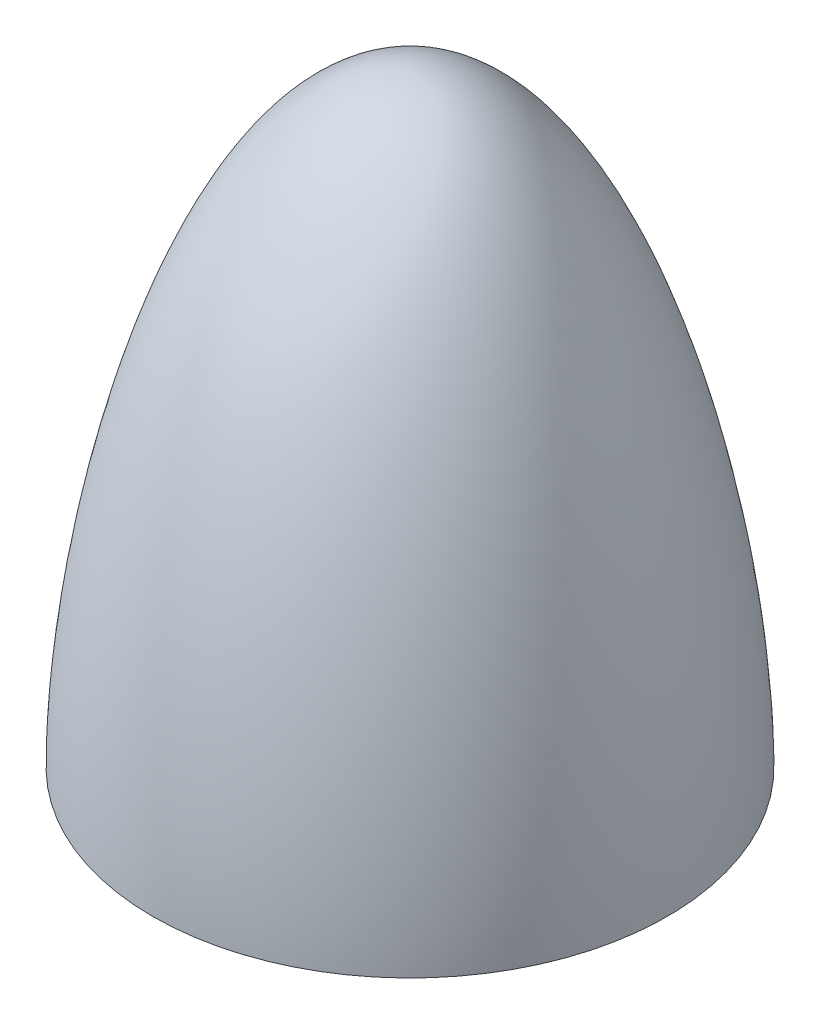
ISO-10303-21;
HEADER;
FILE_DESCRIPTION(('STEP AP214'),'2;1');
FILE_NAME('part.step','',(''),(''),'','','');
FILE_SCHEMA(('AUTOMOTIVE_DESIGN { 1 0 10303 214 1 1 1 1 }'));
ENDSEC;
DATA;
#1=APPLICATION_CONTEXT('core data for automotive mechanical design processes');
#2=APPLICATION_PROTOCOL_DEFINITION('international standard','automotive_design',2000,#1);
#3=PRODUCT_CONTEXT('',#1,'mechanical');
#4=PRODUCT('Part','Part','',(#3));
#5=PRODUCT_RELATED_PRODUCT_CATEGORY('part','',(#4));
#6=PRODUCT_DEFINITION_FORMATION('','',#4);
#7=PRODUCT_DEFINITION_CONTEXT('part definition',#1,'design');
#8=PRODUCT_DEFINITION('design','',#6,#7);
#9=PRODUCT_DEFINITION_SHAPE('','',#8);
#10=(LENGTH_UNIT() NAMED_UNIT(*) SI_UNIT(.MILLI.,.METRE.));
#11=(NAMED_UNIT(*) PLANE_ANGLE_UNIT() SI_UNIT($,.RADIAN.));
#12=(NAMED_UNIT(*) SI_UNIT($,.STERADIAN.) SOLID_ANGLE_UNIT());
#13=UNCERTAINTY_MEASURE_WITH_UNIT(LENGTH_MEASURE(1.E-05),#10,'distance_accuracy_value','');
#14=(GEOMETRIC_REPRESENTATION_CONTEXT(3) GLOBAL_UNCERTAINTY_ASSIGNED_CONTEXT((#13)) GLOBAL_UNIT_ASSIGNED_CONTEXT((#10,
#11,#12)) REPRESENTATION_CONTEXT('',''));
#15=CARTESIAN_POINT('',(0.,0.,0.));
#16=DIRECTION('',(0.,0.,1.));
#17=DIRECTION('',(1.,0.,0.));
#18=AXIS2_PLACEMENT_3D('',#15,#16,#17);
#19=CARTESIAN_POINT('',(0.,10.54,0.));
#20=CARTESIAN_POINT('',(0.879659468788201,10.54,-2.75839981637522));
#21=CARTESIAN_POINT('',(1.37177768443433,3.69860021706056,-4.30156378361265));
#22=CARTESIAN_POINT('',(1.37177768443433,0.,-4.30156378361265));
#23=CARTESIAN_POINT('',(0.,10.54,0.));
#24=CARTESIAN_POINT('',(1.24072743809969,10.54,-2.64324253086239));
#25=CARTESIAN_POINT('',(1.93485106699872,3.69860021719014,-4.12199850462193));
#26=CARTESIAN_POINT('',(1.93485106699872,0.,-4.12199850462193));
#27=CARTESIAN_POINT('',(0.,10.54,0.));
#28=CARTESIAN_POINT('',(1.91709606803146,10.54,-2.26928288518018));
#29=CARTESIAN_POINT('',(2.98965293047793,3.69862711706882,-3.53914755188298));
#30=CARTESIAN_POINT('',(2.98965293047793,0.,-3.53914755188298));
#31=CARTESIAN_POINT('',(0.,10.54,0.));
#32=CARTESIAN_POINT('',(2.63949375408073,10.54,-1.36305283169958));
#33=CARTESIAN_POINT('',(4.11623079789167,3.69861089350345,-2.12562932199819));
#34=CARTESIAN_POINT('',(4.11623079789167,0.,-2.12562932199819));
#35=CARTESIAN_POINT('',(0.,10.54,0.));
#36=CARTESIAN_POINT('',(2.96020337570646,10.54,-0.249251364380078));
#37=CARTESIAN_POINT('',(4.61637086602971,3.698612816411,-0.388707890748583));
#38=CARTESIAN_POINT('',(4.61637086602971,0.,-0.388707890748583));
#39=CARTESIAN_POINT('',(0.,10.54,0.));
#40=CARTESIAN_POINT('',(2.83024363631238,10.54,0.902583648108629));
#41=CARTESIAN_POINT('',(4.4137032067738,3.69861259697037,1.40756173639421));
#42=CARTESIAN_POINT('',(4.4137032067738,0.,1.40756173639421));
#43=CARTESIAN_POINT('',(0.,10.54,0.));
#44=CARTESIAN_POINT('',(2.26940362178673,10.54,1.91695518411527));
#45=CARTESIAN_POINT('',(3.53908151863556,3.69861191870389,2.98944490571386));
#46=CARTESIAN_POINT('',(3.53908151863556,0.,2.98944490571386));
#47=CARTESIAN_POINT('',(0.,10.54,0.));
#48=CARTESIAN_POINT('',(1.36305410295053,10.54,2.63950972126414));
#49=CARTESIAN_POINT('',(2.12565366121877,3.69861321276086,4.11626233078908));
#50=CARTESIAN_POINT('',(2.12565366121877,0.,4.11626233078908));
#51=CARTESIAN_POINT('',(0.,10.54,0.));
#52=CARTESIAN_POINT('',(0.249224159816685,10.54,2.96019721339556));
#53=CARTESIAN_POINT('',(0.388660758254244,3.69861086841509,4.6163484751887));
#54=CARTESIAN_POINT('',(0.388660758254244,0.,4.6163484751887));
#55=CARTESIAN_POINT('',(0.,10.54,0.));
#56=CARTESIAN_POINT('',(-0.902573877601672,10.54,2.83025387275288));
#57=CARTESIAN_POINT('',(-1.40755178745177,3.69861559880703,4.41374273773711));
#58=CARTESIAN_POINT('',(-1.40755178745177,0.,4.41374273773711));
#59=CARTESIAN_POINT('',(0.,10.54,0.));
#60=CARTESIAN_POINT('',(-1.91695323497048,10.54,2.26939871308843));
#61=CARTESIAN_POINT('',(-2.98943926722297,3.69861086841509,3.53906531402985));
#62=CARTESIAN_POINT('',(-2.98943926722297,0.,3.53906531402985));
#63=CARTESIAN_POINT('',(0.,10.54,0.));
#64=CARTESIAN_POINT('',(-2.63949139330165,10.54,1.36308959386558));
#65=CARTESIAN_POINT('',(-4.11623227951802,3.69861321276086,2.12571185356335));
#66=CARTESIAN_POINT('',(-4.11623227951802,0.,2.12571185356335));
#67=CARTESIAN_POINT('',(0.,10.54,0.));
#68=CARTESIAN_POINT('',(-2.96020234425788,10.54,0.249222907324606));
#69=CARTESIAN_POINT('',(-4.61636495235851,3.69861191870389,0.388655974458586));
#70=CARTESIAN_POINT('',(-4.61636495235851,0.,0.388655974458587));
#71=CARTESIAN_POINT('',(0.,10.54,0.));
#72=CARTESIAN_POINT('',(-2.83025118259844,10.54,-0.90255998477658));
#73=CARTESIAN_POINT('',(-4.4137162647559,3.69861259697036,-1.40752078971345));
#74=CARTESIAN_POINT('',(-4.4137162647559,0.,-1.40752078971345));
#75=CARTESIAN_POINT('',(0.,10.54,0.));
#76=CARTESIAN_POINT('',(-2.26938798822044,10.54,-1.91697898452488));
#77=CARTESIAN_POINT('',(-3.53905628472055,3.698612816411,-2.98949066073771));
#78=CARTESIAN_POINT('',(-3.53905628472055,0.,-2.98949066073771));
#79=CARTESIAN_POINT('',(0.,10.54,0.));
#80=CARTESIAN_POINT('',(-1.36307731052818,10.54,-2.63948111290055));
#81=CARTESIAN_POINT('',(-2.12570023296978,3.69861089350345,-4.11619417855895));
#82=CARTESIAN_POINT('',(-2.12570023296978,0.,-4.11619417855895));
#83=CARTESIAN_POINT('',(0.,10.54,0.));
#84=CARTESIAN_POINT('',(-0.249311747837462,10.54,-2.96022659825717));
#85=CARTESIAN_POINT('',(-0.38878736490841,3.69862711629138,-4.6165392258273));
#86=CARTESIAN_POINT('',(-0.38878736490841,0.,-4.6165392258273));
#87=CARTESIAN_POINT('',(0.,10.54,0.));
#88=CARTESIAN_POINT('',(0.518591499476713,10.54,-2.87355710188805));
#89=CARTESIAN_POINT('',(0.808704301869935,3.69860021693099,-4.48112906260337));
#90=CARTESIAN_POINT('',(0.808704301869935,0.,-4.48112906260337));
#91=CARTESIAN_POINT('',(0.,10.54,0.));
#92=CARTESIAN_POINT('',(0.879659468788201,10.54,-2.75839981637522));
#93=CARTESIAN_POINT('',(1.37177768443433,3.69860021706056,-4.30156378361265));
#94=CARTESIAN_POINT('',(1.37177768443433,0.,-4.30156378361265));
#95=B_SPLINE_SURFACE_WITH_KNOTS('',3,3,((#19,#20,#21,#22),(#23,#24,#25,#26),(#27,#28,#29,#30),
(#31,#32,#33,#34),(#35,#36,#37,#38),(#39,#40,#41,#42),(#43,#44,#45,#46),(#47,#48,#49,#50),(#51,
#52,#53,#54),(#55,#56,#57,#58),(#59,#60,#61,#62),(#63,#64,#65,#66),(#67,#68,#69,#70),(#71,#72,
#73,#74),(#75,#76,#77,#78),(#79,#80,#81,#82),(#83,#84,#85,#86),(#87,#88,#89,#90),(#91,#92,#93,
#94)),.UNSPECIFIED.,.T.,.F.,.F.,(4,1,1,1,1,1,1,1,1,1,1,1,1,1,1,1,4),(4,4),(0.,0.0625,0.125,
0.1875,0.25,0.3125,0.375,0.4375,0.5,0.5625,0.625,0.6875,0.75,0.8125,0.875,0.9375,1.),(0.,1.),.UNSPECIFIED.);
#96=CARTESIAN_POINT('',(0.,0.,0.));
#97=DIRECTION('',(0.,1.,0.));
#98=DIRECTION('',(0.,0.,1.));
#99=AXIS2_PLACEMENT_3D('',#96,#97,#98);
#100=CIRCLE('',#99,4.515);
#101=CARTESIAN_POINT('',(0.,0.,4.515));
#102=VERTEX_POINT('',#101);
#103=EDGE_CURVE('E12',#102,#102,#100,.F.);
#104=CARTESIAN_POINT('',(0.,10.54,0.));
#105=VERTEX_POINT('',#104);
#106=VERTEX_LOOP('',#105);
#107=FACE_BOUND('',#106,.T.);
#108=ORIENTED_EDGE('',*,*,#103,.F.);
#109=EDGE_LOOP('',(#108));
#110=FACE_BOUND('',#109,.T.);
#111=ADVANCED_FACE('F51',(#107,#110),#95,.T.);
#112=CARTESIAN_POINT('',(0.,0.,0.));
#113=DIRECTION('',(0.,-1.,0.));
#114=DIRECTION('',(0.,0.,-1.));
#115=AXIS2_PLACEMENT_3D('',#112,#113,#114);
#116=PLANE('',#115);
#117=ORIENTED_EDGE('',*,*,#103,.T.);
#118=EDGE_LOOP('',(#117));
#119=FACE_BOUND('',#118,.T.);
#120=ADVANCED_FACE('F53',(#119),#116,.T.);
#121=CLOSED_SHELL('',(#111,#120));
#122=MANIFOLD_SOLID_BREP('B2',#121);
#123=ADVANCED_BREP_SHAPE_REPRESENTATION('',(#18,#122),#14);
#124=SHAPE_DEFINITION_REPRESENTATION(#9,#123);
ENDSEC;
END-ISO-10303-21;
